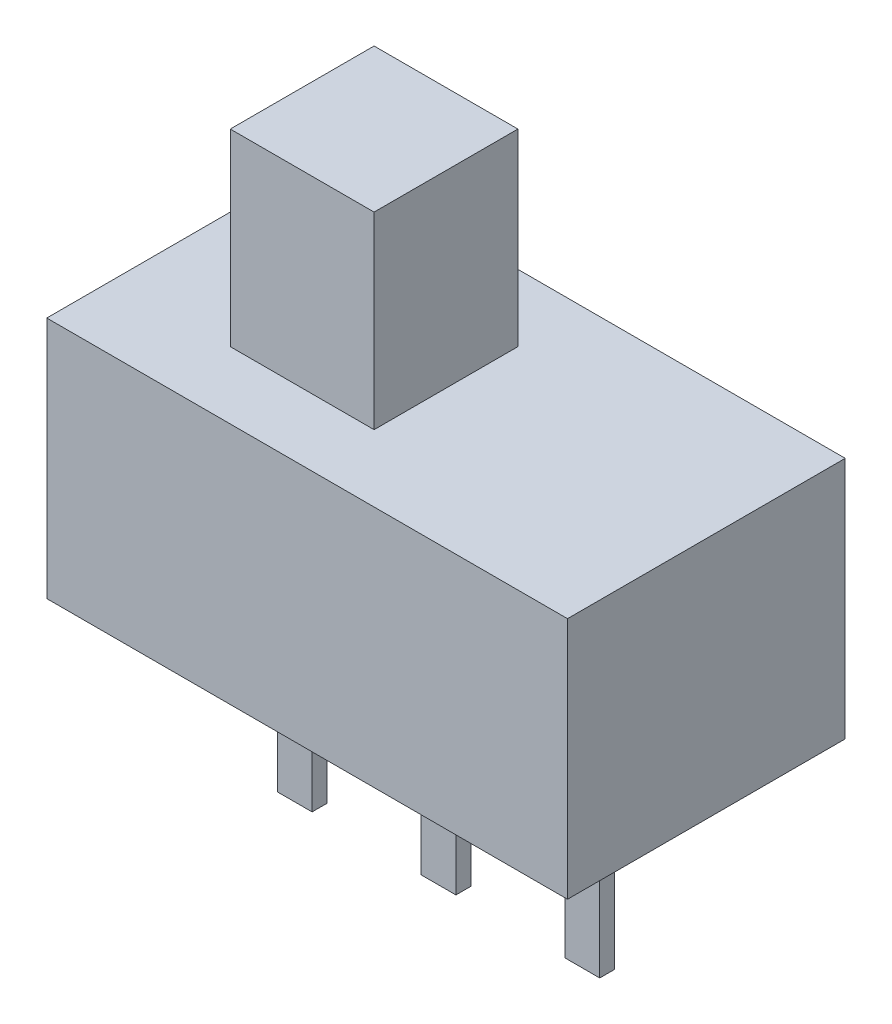
ISO-10303-21;
HEADER;
FILE_DESCRIPTION(('STEP AP214'),'2;1');
FILE_NAME('part.step','',(''),(''),'','','');
FILE_SCHEMA(('AUTOMOTIVE_DESIGN { 1 0 10303 214 1 1 1 1 }'));
ENDSEC;
DATA;
#1=APPLICATION_CONTEXT('core data for automotive mechanical design processes');
#2=APPLICATION_PROTOCOL_DEFINITION('international standard','automotive_design',2000,#1);
#3=PRODUCT_CONTEXT('',#1,'mechanical');
#4=PRODUCT('Part','Part','',(#3));
#5=PRODUCT_RELATED_PRODUCT_CATEGORY('part','',(#4));
#6=PRODUCT_DEFINITION_FORMATION('','',#4);
#7=PRODUCT_DEFINITION_CONTEXT('part definition',#1,'design');
#8=PRODUCT_DEFINITION('design','',#6,#7);
#9=PRODUCT_DEFINITION_SHAPE('','',#8);
#10=(LENGTH_UNIT() NAMED_UNIT(*) SI_UNIT(.MILLI.,.METRE.));
#11=(NAMED_UNIT(*) PLANE_ANGLE_UNIT() SI_UNIT($,.RADIAN.));
#12=(NAMED_UNIT(*) SI_UNIT($,.STERADIAN.) SOLID_ANGLE_UNIT());
#13=UNCERTAINTY_MEASURE_WITH_UNIT(LENGTH_MEASURE(1.E-05),#10,'distance_accuracy_value','');
#14=(GEOMETRIC_REPRESENTATION_CONTEXT(3) GLOBAL_UNCERTAINTY_ASSIGNED_CONTEXT((#13)) GLOBAL_UNIT_ASSIGNED_CONTEXT((#10,
#11,#12)) REPRESENTATION_CONTEXT('',''));
#15=CARTESIAN_POINT('',(0.,0.,0.));
#16=DIRECTION('',(0.,0.,1.));
#17=DIRECTION('',(1.,0.,0.));
#18=AXIS2_PLACEMENT_3D('',#15,#16,#17);
#19=CARTESIAN_POINT('',(0.,0.,0.));
#20=DIRECTION('',(0.,1.,0.));
#21=DIRECTION('',(0.,0.,1.));
#22=AXIS2_PLACEMENT_3D('',#19,#20,#21);
#23=PLANE('',#22);
#24=DIRECTION('',(0.,0.,1.));
#25=VECTOR('',#24,1.);
#26=CARTESIAN_POINT('',(3.25,0.,0.15));
#27=LINE('',#26,#25);
#28=CARTESIAN_POINT('',(3.25,0.,-0.15));
#29=VERTEX_POINT('',#28);
#30=CARTESIAN_POINT('',(3.25,0.,0.15));
#31=VERTEX_POINT('',#30);
#32=EDGE_CURVE('E192',#29,#31,#27,.T.);
#33=ORIENTED_EDGE('',*,*,#32,.F.);
#34=DIRECTION('',(1.,0.,0.));
#35=VECTOR('',#34,1.);
#36=CARTESIAN_POINT('',(2.55,0.,-0.15));
#37=LINE('',#36,#35);
#38=CARTESIAN_POINT('',(2.55,0.,-0.15));
#39=VERTEX_POINT('',#38);
#40=EDGE_CURVE('E205',#39,#29,#37,.T.);
#41=ORIENTED_EDGE('',*,*,#40,.F.);
#42=DIRECTION('',(0.,0.,-1.));
#43=VECTOR('',#42,1.);
#44=CARTESIAN_POINT('',(2.55,0.,0.15));
#45=LINE('',#44,#43);
#46=CARTESIAN_POINT('',(2.55,0.,0.15));
#47=VERTEX_POINT('',#46);
#48=EDGE_CURVE('E214',#47,#39,#45,.T.);
#49=ORIENTED_EDGE('',*,*,#48,.F.);
#50=DIRECTION('',(-1.,0.,0.));
#51=VECTOR('',#50,1.);
#52=CARTESIAN_POINT('',(2.55,0.,0.15));
#53=LINE('',#52,#51);
#54=EDGE_CURVE('E195',#31,#47,#53,.T.);
#55=ORIENTED_EDGE('',*,*,#54,.F.);
#56=EDGE_LOOP('',(#33,#41,#49,#55));
#57=FACE_BOUND('',#56,.T.);
#58=DIRECTION('',(0.,0.,-1.));
#59=VECTOR('',#58,1.);
#60=CARTESIAN_POINT('',(5.25,0.,-2.8));
#61=LINE('',#60,#59);
#62=CARTESIAN_POINT('',(5.25,0.,2.8));
#63=VERTEX_POINT('',#62);
#64=CARTESIAN_POINT('',(5.25,0.,-2.8));
#65=VERTEX_POINT('',#64);
#66=EDGE_CURVE('E292',#63,#65,#61,.T.);
#67=ORIENTED_EDGE('',*,*,#66,.F.);
#68=DIRECTION('',(1.,0.,0.));
#69=VECTOR('',#68,1.);
#70=CARTESIAN_POINT('',(-5.25,0.,2.8));
#71=LINE('',#70,#69);
#72=CARTESIAN_POINT('',(-5.25,0.,2.8));
#73=VERTEX_POINT('',#72);
#74=EDGE_CURVE('E297',#73,#63,#71,.T.);
#75=ORIENTED_EDGE('',*,*,#74,.F.);
#76=DIRECTION('',(0.,0.,1.));
#77=VECTOR('',#76,1.);
#78=CARTESIAN_POINT('',(-5.25,0.,-2.8));
#79=LINE('',#78,#77);
#80=CARTESIAN_POINT('',(-5.25,0.,-2.8));
#81=VERTEX_POINT('',#80);
#82=EDGE_CURVE('E308',#81,#73,#79,.T.);
#83=ORIENTED_EDGE('',*,*,#82,.F.);
#84=DIRECTION('',(-1.,0.,0.));
#85=VECTOR('',#84,1.);
#86=CARTESIAN_POINT('',(-5.25,0.,-2.8));
#87=LINE('',#86,#85);
#88=EDGE_CURVE('E306',#65,#81,#87,.T.);
#89=ORIENTED_EDGE('',*,*,#88,.F.);
#90=EDGE_LOOP('',(#67,#75,#83,#89));
#91=FACE_BOUND('',#90,.T.);
#92=DIRECTION('',(0.,0.,1.));
#93=VECTOR('',#92,1.);
#94=CARTESIAN_POINT('',(0.35,0.,0.15));
#95=LINE('',#94,#93);
#96=CARTESIAN_POINT('',(0.35,0.,-0.15));
#97=VERTEX_POINT('',#96);
#98=CARTESIAN_POINT('',(0.35,0.,0.15));
#99=VERTEX_POINT('',#98);
#100=EDGE_CURVE('E230',#97,#99,#95,.T.);
#101=ORIENTED_EDGE('',*,*,#100,.F.);
#102=DIRECTION('',(1.,0.,0.));
#103=VECTOR('',#102,1.);
#104=CARTESIAN_POINT('',(-0.35,0.,-0.15));
#105=LINE('',#104,#103);
#106=CARTESIAN_POINT('',(-0.35,0.,-0.15));
#107=VERTEX_POINT('',#106);
#108=EDGE_CURVE('E235',#107,#97,#105,.T.);
#109=ORIENTED_EDGE('',*,*,#108,.F.);
#110=DIRECTION('',(0.,0.,-1.));
#111=VECTOR('',#110,1.);
#112=CARTESIAN_POINT('',(-0.35,0.,0.15));
#113=LINE('',#112,#111);
#114=CARTESIAN_POINT('',(-0.35,0.,0.15));
#115=VERTEX_POINT('',#114);
#116=EDGE_CURVE('E247',#115,#107,#113,.T.);
#117=ORIENTED_EDGE('',*,*,#116,.F.);
#118=DIRECTION('',(-1.,0.,0.));
#119=VECTOR('',#118,1.);
#120=CARTESIAN_POINT('',(-0.35,0.,0.15));
#121=LINE('',#120,#119);
#122=EDGE_CURVE('E244',#99,#115,#121,.T.);
#123=ORIENTED_EDGE('',*,*,#122,.F.);
#124=EDGE_LOOP('',(#101,#109,#117,#123));
#125=FACE_BOUND('',#124,.T.);
#126=DIRECTION('',(0.,0.,1.));
#127=VECTOR('',#126,1.);
#128=CARTESIAN_POINT('',(-2.55,0.,0.15));
#129=LINE('',#128,#127);
#130=CARTESIAN_POINT('',(-2.55,0.,-0.15));
#131=VERTEX_POINT('',#130);
#132=CARTESIAN_POINT('',(-2.55,0.,0.15));
#133=VERTEX_POINT('',#132);
#134=EDGE_CURVE('E191',#131,#133,#129,.T.);
#135=ORIENTED_EDGE('',*,*,#134,.F.);
#136=DIRECTION('',(1.,0.,0.));
#137=VECTOR('',#136,1.);
#138=CARTESIAN_POINT('',(-3.25,0.,-0.15));
#139=LINE('',#138,#137);
#140=CARTESIAN_POINT('',(-3.25,0.,-0.15));
#141=VERTEX_POINT('',#140);
#142=EDGE_CURVE('E188',#141,#131,#139,.T.);
#143=ORIENTED_EDGE('',*,*,#142,.F.);
#144=DIRECTION('',(0.,0.,-1.));
#145=VECTOR('',#144,1.);
#146=CARTESIAN_POINT('',(-3.25,0.,0.15));
#147=LINE('',#146,#145);
#148=CARTESIAN_POINT('',(-3.25,0.,0.15));
#149=VERTEX_POINT('',#148);
#150=EDGE_CURVE('E54',#149,#141,#147,.T.);
#151=ORIENTED_EDGE('',*,*,#150,.F.);
#152=DIRECTION('',(-1.,0.,0.));
#153=VECTOR('',#152,1.);
#154=CARTESIAN_POINT('',(-3.25,0.,0.15));
#155=LINE('',#154,#153);
#156=EDGE_CURVE('E49',#133,#149,#155,.T.);
#157=ORIENTED_EDGE('',*,*,#156,.F.);
#158=EDGE_LOOP('',(#135,#143,#151,#157));
#159=FACE_BOUND('',#158,.T.);
#160=ADVANCED_FACE('F34',(#57,#91,#125,#159),#23,.F.);
#161=CARTESIAN_POINT('',(0.,4.9,0.));
#162=DIRECTION('',(0.,1.,0.));
#163=DIRECTION('',(0.,0.,1.));
#164=AXIS2_PLACEMENT_3D('',#161,#162,#163);
#165=PLANE('',#164);
#166=DIRECTION('',(0.,0.,-1.));
#167=VECTOR('',#166,1.);
#168=CARTESIAN_POINT('',(5.25,4.9,-2.8));
#169=LINE('',#168,#167);
#170=CARTESIAN_POINT('',(5.25,4.9,2.8));
#171=VERTEX_POINT('',#170);
#172=CARTESIAN_POINT('',(5.25,4.9,-2.8));
#173=VERTEX_POINT('',#172);
#174=EDGE_CURVE('E293',#171,#173,#169,.T.);
#175=ORIENTED_EDGE('',*,*,#174,.T.);
#176=DIRECTION('',(-1.,0.,0.));
#177=VECTOR('',#176,1.);
#178=CARTESIAN_POINT('',(-5.25,4.9,-2.8));
#179=LINE('',#178,#177);
#180=CARTESIAN_POINT('',(-5.25,4.9,-2.8));
#181=VERTEX_POINT('',#180);
#182=EDGE_CURVE('E296',#173,#181,#179,.T.);
#183=ORIENTED_EDGE('',*,*,#182,.T.);
#184=DIRECTION('',(0.,0.,1.));
#185=VECTOR('',#184,1.);
#186=CARTESIAN_POINT('',(-5.25,4.9,-2.8));
#187=LINE('',#186,#185);
#188=CARTESIAN_POINT('',(-5.25,4.9,2.8));
#189=VERTEX_POINT('',#188);
#190=EDGE_CURVE('E299',#181,#189,#187,.T.);
#191=ORIENTED_EDGE('',*,*,#190,.T.);
#192=DIRECTION('',(1.,0.,0.));
#193=VECTOR('',#192,1.);
#194=CARTESIAN_POINT('',(-5.25,4.9,2.8));
#195=LINE('',#194,#193);
#196=EDGE_CURVE('E301',#189,#171,#195,.T.);
#197=ORIENTED_EDGE('',*,*,#196,.T.);
#198=EDGE_LOOP('',(#175,#183,#191,#197));
#199=FACE_BOUND('',#198,.T.);
#200=DIRECTION('',(-1.,0.,0.));
#201=VECTOR('',#200,1.);
#202=CARTESIAN_POINT('',(-2.9,4.9,-1.45));
#203=LINE('',#202,#201);
#204=CARTESIAN_POINT('',(0.,4.9,-1.45));
#205=VERTEX_POINT('',#204);
#206=CARTESIAN_POINT('',(-2.9,4.9,-1.45));
#207=VERTEX_POINT('',#206);
#208=EDGE_CURVE('E277',#205,#207,#203,.T.);
#209=ORIENTED_EDGE('',*,*,#208,.F.);
#210=DIRECTION('',(0.,0.,-1.));
#211=VECTOR('',#210,1.);
#212=CARTESIAN_POINT('',(0.,4.9,-1.45));
#213=LINE('',#212,#211);
#214=CARTESIAN_POINT('',(0.,4.9,1.45));
#215=VERTEX_POINT('',#214);
#216=EDGE_CURVE('E263',#215,#205,#213,.T.);
#217=ORIENTED_EDGE('',*,*,#216,.F.);
#218=DIRECTION('',(1.,0.,0.));
#219=VECTOR('',#218,1.);
#220=CARTESIAN_POINT('',(-2.9,4.9,1.45));
#221=LINE('',#220,#219);
#222=CARTESIAN_POINT('',(-2.9,4.9,1.45));
#223=VERTEX_POINT('',#222);
#224=EDGE_CURVE('E268',#223,#215,#221,.T.);
#225=ORIENTED_EDGE('',*,*,#224,.F.);
#226=DIRECTION('',(0.,0.,1.));
#227=VECTOR('',#226,1.);
#228=CARTESIAN_POINT('',(-2.9,4.9,-1.45));
#229=LINE('',#228,#227);
#230=EDGE_CURVE('E279',#207,#223,#229,.T.);
#231=ORIENTED_EDGE('',*,*,#230,.F.);
#232=EDGE_LOOP('',(#209,#217,#225,#231));
#233=FACE_BOUND('',#232,.T.);
#234=ADVANCED_FACE('F335',(#199,#233),#165,.T.);
#235=CARTESIAN_POINT('',(5.25,4.9,-2.8));
#236=DIRECTION('',(-1.,0.,0.));
#237=DIRECTION('',(0.,0.,1.));
#238=AXIS2_PLACEMENT_3D('',#235,#236,#237);
#239=PLANE('',#238);
#240=ORIENTED_EDGE('',*,*,#66,.T.);
#241=DIRECTION('',(0.,-1.,0.));
#242=VECTOR('',#241,1.);
#243=CARTESIAN_POINT('',(5.25,4.9,-2.8));
#244=LINE('',#243,#242);
#245=EDGE_CURVE('E11',#173,#65,#244,.T.);
#246=ORIENTED_EDGE('',*,*,#245,.F.);
#247=ORIENTED_EDGE('',*,*,#174,.F.);
#248=DIRECTION('',(0.,-1.,0.));
#249=VECTOR('',#248,1.);
#250=CARTESIAN_POINT('',(5.25,4.9,2.8));
#251=LINE('',#250,#249);
#252=EDGE_CURVE('E303',#171,#63,#251,.T.);
#253=ORIENTED_EDGE('',*,*,#252,.T.);
#254=EDGE_LOOP('',(#240,#246,#247,#253));
#255=FACE_BOUND('',#254,.T.);
#256=ADVANCED_FACE('F36',(#255),#239,.F.);
#257=CARTESIAN_POINT('',(-5.25,4.9,-2.8));
#258=DIRECTION('',(0.,0.,1.));
#259=DIRECTION('',(1.,0.,0.));
#260=AXIS2_PLACEMENT_3D('',#257,#258,#259);
#261=PLANE('',#260);
#262=ORIENTED_EDGE('',*,*,#88,.T.);
#263=DIRECTION('',(0.,-1.,0.));
#264=VECTOR('',#263,1.);
#265=CARTESIAN_POINT('',(-5.25,4.9,-2.8));
#266=LINE('',#265,#264);
#267=EDGE_CURVE('E42',#181,#81,#266,.T.);
#268=ORIENTED_EDGE('',*,*,#267,.F.);
#269=ORIENTED_EDGE('',*,*,#182,.F.);
#270=ORIENTED_EDGE('',*,*,#245,.T.);
#271=EDGE_LOOP('',(#262,#268,#269,#270));
#272=FACE_BOUND('',#271,.T.);
#273=ADVANCED_FACE('F337',(#272),#261,.F.);
#274=CARTESIAN_POINT('',(-5.25,4.9,-2.8));
#275=DIRECTION('',(1.,0.,0.));
#276=DIRECTION('',(0.,0.,-1.));
#277=AXIS2_PLACEMENT_3D('',#274,#275,#276);
#278=PLANE('',#277);
#279=ORIENTED_EDGE('',*,*,#82,.T.);
#280=DIRECTION('',(0.,-1.,0.));
#281=VECTOR('',#280,1.);
#282=CARTESIAN_POINT('',(-5.25,4.9,2.8));
#283=LINE('',#282,#281);
#284=EDGE_CURVE('E313',#189,#73,#283,.T.);
#285=ORIENTED_EDGE('',*,*,#284,.F.);
#286=ORIENTED_EDGE('',*,*,#190,.F.);
#287=ORIENTED_EDGE('',*,*,#267,.T.);
#288=EDGE_LOOP('',(#279,#285,#286,#287));
#289=FACE_BOUND('',#288,.T.);
#290=ADVANCED_FACE('F320',(#289),#278,.F.);
#291=CARTESIAN_POINT('',(-5.25,4.9,2.8));
#292=DIRECTION('',(0.,0.,-1.));
#293=DIRECTION('',(-1.,0.,0.));
#294=AXIS2_PLACEMENT_3D('',#291,#292,#293);
#295=PLANE('',#294);
#296=ORIENTED_EDGE('',*,*,#74,.T.);
#297=ORIENTED_EDGE('',*,*,#252,.F.);
#298=ORIENTED_EDGE('',*,*,#196,.F.);
#299=ORIENTED_EDGE('',*,*,#284,.T.);
#300=EDGE_LOOP('',(#296,#297,#298,#299));
#301=FACE_BOUND('',#300,.T.);
#302=ADVANCED_FACE('F329',(#301),#295,.F.);
#303=CARTESIAN_POINT('',(0.,8.7,-1.45));
#304=DIRECTION('',(-1.,0.,0.));
#305=DIRECTION('',(0.,0.,1.));
#306=AXIS2_PLACEMENT_3D('',#303,#304,#305);
#307=PLANE('',#306);
#308=ORIENTED_EDGE('',*,*,#216,.T.);
#309=DIRECTION('',(0.,-1.,0.));
#310=VECTOR('',#309,1.);
#311=CARTESIAN_POINT('',(0.,8.7,-1.45));
#312=LINE('',#311,#310);
#313=CARTESIAN_POINT('',(0.,8.7,-1.45));
#314=VERTEX_POINT('',#313);
#315=EDGE_CURVE('E290',#314,#205,#312,.T.);
#316=ORIENTED_EDGE('',*,*,#315,.F.);
#317=DIRECTION('',(0.,0.,-1.));
#318=VECTOR('',#317,1.);
#319=CARTESIAN_POINT('',(0.,8.7,-1.45));
#320=LINE('',#319,#318);
#321=CARTESIAN_POINT('',(0.,8.7,1.45));
#322=VERTEX_POINT('',#321);
#323=EDGE_CURVE('E264',#322,#314,#320,.T.);
#324=ORIENTED_EDGE('',*,*,#323,.F.);
#325=DIRECTION('',(0.,-1.,0.));
#326=VECTOR('',#325,1.);
#327=CARTESIAN_POINT('',(0.,8.7,1.45));
#328=LINE('',#327,#326);
#329=EDGE_CURVE('E274',#322,#215,#328,.T.);
#330=ORIENTED_EDGE('',*,*,#329,.T.);
#331=EDGE_LOOP('',(#308,#316,#324,#330));
#332=FACE_BOUND('',#331,.T.);
#333=ADVANCED_FACE('F354',(#332),#307,.F.);
#334=CARTESIAN_POINT('',(-2.9,8.7,-1.45));
#335=DIRECTION('',(0.,0.,1.));
#336=DIRECTION('',(1.,0.,0.));
#337=AXIS2_PLACEMENT_3D('',#334,#335,#336);
#338=PLANE('',#337);
#339=ORIENTED_EDGE('',*,*,#208,.T.);
#340=DIRECTION('',(0.,-1.,0.));
#341=VECTOR('',#340,1.);
#342=CARTESIAN_POINT('',(-2.9,8.7,-1.45));
#343=LINE('',#342,#341);
#344=CARTESIAN_POINT('',(-2.9,8.7,-1.45));
#345=VERTEX_POINT('',#344);
#346=EDGE_CURVE('E287',#345,#207,#343,.T.);
#347=ORIENTED_EDGE('',*,*,#346,.F.);
#348=DIRECTION('',(-1.,0.,0.));
#349=VECTOR('',#348,1.);
#350=CARTESIAN_POINT('',(-2.9,8.7,-1.45));
#351=LINE('',#350,#349);
#352=EDGE_CURVE('E267',#314,#345,#351,.T.);
#353=ORIENTED_EDGE('',*,*,#352,.F.);
#354=ORIENTED_EDGE('',*,*,#315,.T.);
#355=EDGE_LOOP('',(#339,#347,#353,#354));
#356=FACE_BOUND('',#355,.T.);
#357=ADVANCED_FACE('F358',(#356),#338,.F.);
#358=CARTESIAN_POINT('',(-2.9,8.7,-1.45));
#359=DIRECTION('',(1.,0.,0.));
#360=DIRECTION('',(0.,0.,-1.));
#361=AXIS2_PLACEMENT_3D('',#358,#359,#360);
#362=PLANE('',#361);
#363=ORIENTED_EDGE('',*,*,#230,.T.);
#364=DIRECTION('',(0.,-1.,0.));
#365=VECTOR('',#364,1.);
#366=CARTESIAN_POINT('',(-2.9,8.7,1.45));
#367=LINE('',#366,#365);
#368=CARTESIAN_POINT('',(-2.9,8.7,1.45));
#369=VERTEX_POINT('',#368);
#370=EDGE_CURVE('E285',#369,#223,#367,.T.);
#371=ORIENTED_EDGE('',*,*,#370,.F.);
#372=DIRECTION('',(0.,0.,1.));
#373=VECTOR('',#372,1.);
#374=CARTESIAN_POINT('',(-2.9,8.7,-1.45));
#375=LINE('',#374,#373);
#376=EDGE_CURVE('E270',#345,#369,#375,.T.);
#377=ORIENTED_EDGE('',*,*,#376,.F.);
#378=ORIENTED_EDGE('',*,*,#346,.T.);
#379=EDGE_LOOP('',(#363,#371,#377,#378));
#380=FACE_BOUND('',#379,.T.);
#381=ADVANCED_FACE('F363',(#380),#362,.F.);
#382=CARTESIAN_POINT('',(-2.9,8.7,1.45));
#383=DIRECTION('',(0.,0.,-1.));
#384=DIRECTION('',(-1.,0.,0.));
#385=AXIS2_PLACEMENT_3D('',#382,#383,#384);
#386=PLANE('',#385);
#387=ORIENTED_EDGE('',*,*,#224,.T.);
#388=ORIENTED_EDGE('',*,*,#329,.F.);
#389=DIRECTION('',(1.,0.,0.));
#390=VECTOR('',#389,1.);
#391=CARTESIAN_POINT('',(-2.9,8.7,1.45));
#392=LINE('',#391,#390);
#393=EDGE_CURVE('E272',#369,#322,#392,.T.);
#394=ORIENTED_EDGE('',*,*,#393,.F.);
#395=ORIENTED_EDGE('',*,*,#370,.T.);
#396=EDGE_LOOP('',(#387,#388,#394,#395));
#397=FACE_BOUND('',#396,.T.);
#398=ADVANCED_FACE('F369',(#397),#386,.F.);
#399=CARTESIAN_POINT('',(0.,8.7,0.));
#400=DIRECTION('',(0.,1.,0.));
#401=DIRECTION('',(0.,0.,1.));
#402=AXIS2_PLACEMENT_3D('',#399,#400,#401);
#403=PLANE('',#402);
#404=ORIENTED_EDGE('',*,*,#323,.T.);
#405=ORIENTED_EDGE('',*,*,#352,.T.);
#406=ORIENTED_EDGE('',*,*,#376,.T.);
#407=ORIENTED_EDGE('',*,*,#393,.T.);
#408=EDGE_LOOP('',(#404,#405,#406,#407));
#409=FACE_BOUND('',#408,.T.);
#410=ADVANCED_FACE('F373',(#409),#403,.T.);
#411=CARTESIAN_POINT('',(0.35,-3.7,0.15));
#412=DIRECTION('',(-1.,0.,0.));
#413=DIRECTION('',(0.,0.,1.));
#414=AXIS2_PLACEMENT_3D('',#411,#412,#413);
#415=PLANE('',#414);
#416=ORIENTED_EDGE('',*,*,#100,.T.);
#417=DIRECTION('',(0.,1.,0.));
#418=VECTOR('',#417,1.);
#419=CARTESIAN_POINT('',(0.35,-3.7,0.15));
#420=LINE('',#419,#418);
#421=CARTESIAN_POINT('',(0.35,-3.7,0.15));
#422=VERTEX_POINT('',#421);
#423=EDGE_CURVE('E260',#422,#99,#420,.T.);
#424=ORIENTED_EDGE('',*,*,#423,.F.);
#425=DIRECTION('',(0.,0.,1.));
#426=VECTOR('',#425,1.);
#427=CARTESIAN_POINT('',(0.35,-3.7,0.15));
#428=LINE('',#427,#426);
#429=CARTESIAN_POINT('',(0.35,-3.7,-0.15));
#430=VERTEX_POINT('',#429);
#431=EDGE_CURVE('E231',#430,#422,#428,.T.);
#432=ORIENTED_EDGE('',*,*,#431,.F.);
#433=DIRECTION('',(0.,1.,0.));
#434=VECTOR('',#433,1.);
#435=CARTESIAN_POINT('',(0.35,-3.7,-0.15));
#436=LINE('',#435,#434);
#437=EDGE_CURVE('E241',#430,#97,#436,.T.);
#438=ORIENTED_EDGE('',*,*,#437,.T.);
#439=EDGE_LOOP('',(#416,#424,#432,#438));
#440=FACE_BOUND('',#439,.T.);
#441=ADVANCED_FACE('F377',(#440),#415,.F.);
#442=CARTESIAN_POINT('',(-0.35,-3.7,0.15));
#443=DIRECTION('',(0.,0.,-1.));
#444=DIRECTION('',(-1.,0.,0.));
#445=AXIS2_PLACEMENT_3D('',#442,#443,#444);
#446=PLANE('',#445);
#447=ORIENTED_EDGE('',*,*,#122,.T.);
#448=DIRECTION('',(0.,1.,0.));
#449=VECTOR('',#448,1.);
#450=CARTESIAN_POINT('',(-0.35,-3.7,0.15));
#451=LINE('',#450,#449);
#452=CARTESIAN_POINT('',(-0.35,-3.7,0.15));
#453=VERTEX_POINT('',#452);
#454=EDGE_CURVE('E257',#453,#115,#451,.T.);
#455=ORIENTED_EDGE('',*,*,#454,.F.);
#456=DIRECTION('',(-1.,0.,0.));
#457=VECTOR('',#456,1.);
#458=CARTESIAN_POINT('',(-0.35,-3.7,0.15));
#459=LINE('',#458,#457);
#460=EDGE_CURVE('E234',#422,#453,#459,.T.);
#461=ORIENTED_EDGE('',*,*,#460,.F.);
#462=ORIENTED_EDGE('',*,*,#423,.T.);
#463=EDGE_LOOP('',(#447,#455,#461,#462));
#464=FACE_BOUND('',#463,.T.);
#465=ADVANCED_FACE('F381',(#464),#446,.F.);
#466=CARTESIAN_POINT('',(-0.35,-3.7,0.15));
#467=DIRECTION('',(1.,0.,0.));
#468=DIRECTION('',(0.,0.,-1.));
#469=AXIS2_PLACEMENT_3D('',#466,#467,#468);
#470=PLANE('',#469);
#471=ORIENTED_EDGE('',*,*,#116,.T.);
#472=DIRECTION('',(0.,1.,0.));
#473=VECTOR('',#472,1.);
#474=CARTESIAN_POINT('',(-0.35,-3.7,-0.15));
#475=LINE('',#474,#473);
#476=CARTESIAN_POINT('',(-0.35,-3.7,-0.15));
#477=VERTEX_POINT('',#476);
#478=EDGE_CURVE('E254',#477,#107,#475,.T.);
#479=ORIENTED_EDGE('',*,*,#478,.F.);
#480=DIRECTION('',(0.,0.,-1.));
#481=VECTOR('',#480,1.);
#482=CARTESIAN_POINT('',(-0.35,-3.7,0.15));
#483=LINE('',#482,#481);
#484=EDGE_CURVE('E237',#453,#477,#483,.T.);
#485=ORIENTED_EDGE('',*,*,#484,.F.);
#486=ORIENTED_EDGE('',*,*,#454,.T.);
#487=EDGE_LOOP('',(#471,#479,#485,#486));
#488=FACE_BOUND('',#487,.T.);
#489=ADVANCED_FACE('F385',(#488),#470,.F.);
#490=CARTESIAN_POINT('',(-0.35,-3.7,-0.15));
#491=DIRECTION('',(0.,0.,1.));
#492=DIRECTION('',(1.,0.,0.));
#493=AXIS2_PLACEMENT_3D('',#490,#491,#492);
#494=PLANE('',#493);
#495=ORIENTED_EDGE('',*,*,#108,.T.);
#496=ORIENTED_EDGE('',*,*,#437,.F.);
#497=DIRECTION('',(1.,0.,0.));
#498=VECTOR('',#497,1.);
#499=CARTESIAN_POINT('',(-0.35,-3.7,-0.15));
#500=LINE('',#499,#498);
#501=EDGE_CURVE('E239',#477,#430,#500,.T.);
#502=ORIENTED_EDGE('',*,*,#501,.F.);
#503=ORIENTED_EDGE('',*,*,#478,.T.);
#504=EDGE_LOOP('',(#495,#496,#502,#503));
#505=FACE_BOUND('',#504,.T.);
#506=ADVANCED_FACE('F389',(#505),#494,.F.);
#507=CARTESIAN_POINT('',(0.,-3.7,0.));
#508=DIRECTION('',(0.,-1.,0.));
#509=DIRECTION('',(0.,0.,-1.));
#510=AXIS2_PLACEMENT_3D('',#507,#508,#509);
#511=PLANE('',#510);
#512=ORIENTED_EDGE('',*,*,#431,.T.);
#513=ORIENTED_EDGE('',*,*,#460,.T.);
#514=ORIENTED_EDGE('',*,*,#484,.T.);
#515=ORIENTED_EDGE('',*,*,#501,.T.);
#516=EDGE_LOOP('',(#512,#513,#514,#515));
#517=FACE_BOUND('',#516,.T.);
#518=ADVANCED_FACE('F393',(#517),#511,.T.);
#519=CARTESIAN_POINT('',(3.25,-3.7,0.15));
#520=DIRECTION('',(-1.,0.,0.));
#521=DIRECTION('',(0.,0.,1.));
#522=AXIS2_PLACEMENT_3D('',#519,#520,#521);
#523=PLANE('',#522);
#524=ORIENTED_EDGE('',*,*,#32,.T.);
#525=DIRECTION('',(0.,1.,0.));
#526=VECTOR('',#525,1.);
#527=CARTESIAN_POINT('',(3.25,-3.7,0.15));
#528=LINE('',#527,#526);
#529=CARTESIAN_POINT('',(3.25,-3.7,0.15));
#530=VERTEX_POINT('',#529);
#531=EDGE_CURVE('E227',#530,#31,#528,.T.);
#532=ORIENTED_EDGE('',*,*,#531,.F.);
#533=DIRECTION('',(0.,0.,1.));
#534=VECTOR('',#533,1.);
#535=CARTESIAN_POINT('',(3.25,-3.7,0.15));
#536=LINE('',#535,#534);
#537=CARTESIAN_POINT('',(3.25,-3.7,-0.15));
#538=VERTEX_POINT('',#537);
#539=EDGE_CURVE('E201',#538,#530,#536,.T.);
#540=ORIENTED_EDGE('',*,*,#539,.F.);
#541=DIRECTION('',(0.,1.,0.));
#542=VECTOR('',#541,1.);
#543=CARTESIAN_POINT('',(3.25,-3.7,-0.15));
#544=LINE('',#543,#542);
#545=EDGE_CURVE('E210',#538,#29,#544,.T.);
#546=ORIENTED_EDGE('',*,*,#545,.T.);
#547=EDGE_LOOP('',(#524,#532,#540,#546));
#548=FACE_BOUND('',#547,.T.);
#549=ADVANCED_FACE('F397',(#548),#523,.F.);
#550=CARTESIAN_POINT('',(2.55,-3.7,0.15));
#551=DIRECTION('',(0.,0.,-1.));
#552=DIRECTION('',(-1.,0.,0.));
#553=AXIS2_PLACEMENT_3D('',#550,#551,#552);
#554=PLANE('',#553);
#555=ORIENTED_EDGE('',*,*,#54,.T.);
#556=DIRECTION('',(0.,1.,0.));
#557=VECTOR('',#556,1.);
#558=CARTESIAN_POINT('',(2.55,-3.7,0.15));
#559=LINE('',#558,#557);
#560=CARTESIAN_POINT('',(2.55,-3.7,0.15));
#561=VERTEX_POINT('',#560);
#562=EDGE_CURVE('E224',#561,#47,#559,.T.);
#563=ORIENTED_EDGE('',*,*,#562,.F.);
#564=DIRECTION('',(-1.,0.,0.));
#565=VECTOR('',#564,1.);
#566=CARTESIAN_POINT('',(2.55,-3.7,0.15));
#567=LINE('',#566,#565);
#568=EDGE_CURVE('E204',#530,#561,#567,.T.);
#569=ORIENTED_EDGE('',*,*,#568,.F.);
#570=ORIENTED_EDGE('',*,*,#531,.T.);
#571=EDGE_LOOP('',(#555,#563,#569,#570));
#572=FACE_BOUND('',#571,.T.);
#573=ADVANCED_FACE('F401',(#572),#554,.F.);
#574=CARTESIAN_POINT('',(2.55,-3.7,0.15));
#575=DIRECTION('',(1.,0.,0.));
#576=DIRECTION('',(0.,0.,-1.));
#577=AXIS2_PLACEMENT_3D('',#574,#575,#576);
#578=PLANE('',#577);
#579=ORIENTED_EDGE('',*,*,#48,.T.);
#580=DIRECTION('',(0.,1.,0.));
#581=VECTOR('',#580,1.);
#582=CARTESIAN_POINT('',(2.55,-3.7,-0.15));
#583=LINE('',#582,#581);
#584=CARTESIAN_POINT('',(2.55,-3.7,-0.15));
#585=VERTEX_POINT('',#584);
#586=EDGE_CURVE('E221',#585,#39,#583,.T.);
#587=ORIENTED_EDGE('',*,*,#586,.F.);
#588=DIRECTION('',(0.,0.,-1.));
#589=VECTOR('',#588,1.);
#590=CARTESIAN_POINT('',(2.55,-3.7,0.15));
#591=LINE('',#590,#589);
#592=EDGE_CURVE('E207',#561,#585,#591,.T.);
#593=ORIENTED_EDGE('',*,*,#592,.F.);
#594=ORIENTED_EDGE('',*,*,#562,.T.);
#595=EDGE_LOOP('',(#579,#587,#593,#594));
#596=FACE_BOUND('',#595,.T.);
#597=ADVANCED_FACE('F405',(#596),#578,.F.);
#598=CARTESIAN_POINT('',(2.55,-3.7,-0.15));
#599=DIRECTION('',(0.,0.,1.));
#600=DIRECTION('',(1.,0.,0.));
#601=AXIS2_PLACEMENT_3D('',#598,#599,#600);
#602=PLANE('',#601);
#603=ORIENTED_EDGE('',*,*,#40,.T.);
#604=ORIENTED_EDGE('',*,*,#545,.F.);
#605=DIRECTION('',(1.,0.,0.));
#606=VECTOR('',#605,1.);
#607=CARTESIAN_POINT('',(2.55,-3.7,-0.15));
#608=LINE('',#607,#606);
#609=EDGE_CURVE('E209',#585,#538,#608,.T.);
#610=ORIENTED_EDGE('',*,*,#609,.F.);
#611=ORIENTED_EDGE('',*,*,#586,.T.);
#612=EDGE_LOOP('',(#603,#604,#610,#611));
#613=FACE_BOUND('',#612,.T.);
#614=ADVANCED_FACE('F409',(#613),#602,.F.);
#615=CARTESIAN_POINT('',(0.,-3.7,0.));
#616=DIRECTION('',(0.,-1.,0.));
#617=DIRECTION('',(0.,0.,-1.));
#618=AXIS2_PLACEMENT_3D('',#615,#616,#617);
#619=PLANE('',#618);
#620=ORIENTED_EDGE('',*,*,#539,.T.);
#621=ORIENTED_EDGE('',*,*,#568,.T.);
#622=ORIENTED_EDGE('',*,*,#592,.T.);
#623=ORIENTED_EDGE('',*,*,#609,.T.);
#624=EDGE_LOOP('',(#620,#621,#622,#623));
#625=FACE_BOUND('',#624,.T.);
#626=ADVANCED_FACE('F413',(#625),#619,.T.);
#627=CARTESIAN_POINT('',(-2.55,-3.7,0.15));
#628=DIRECTION('',(-1.,0.,0.));
#629=DIRECTION('',(0.,0.,1.));
#630=AXIS2_PLACEMENT_3D('',#627,#628,#629);
#631=PLANE('',#630);
#632=ORIENTED_EDGE('',*,*,#134,.T.);
#633=DIRECTION('',(0.,1.,0.));
#634=VECTOR('',#633,1.);
#635=CARTESIAN_POINT('',(-2.55,-3.7,0.15));
#636=LINE('',#635,#634);
#637=CARTESIAN_POINT('',(-2.55,-3.7,0.15));
#638=VERTEX_POINT('',#637);
#639=EDGE_CURVE('E172',#638,#133,#636,.T.);
#640=ORIENTED_EDGE('',*,*,#639,.F.);
#641=DIRECTION('',(0.,0.,1.));
#642=VECTOR('',#641,1.);
#643=CARTESIAN_POINT('',(-2.55,-3.7,0.15));
#644=LINE('',#643,#642);
#645=CARTESIAN_POINT('',(-2.55,-3.7,-0.15));
#646=VERTEX_POINT('',#645);
#647=EDGE_CURVE('E179',#646,#638,#644,.T.);
#648=ORIENTED_EDGE('',*,*,#647,.F.);
#649=DIRECTION('',(0.,1.,0.));
#650=VECTOR('',#649,1.);
#651=CARTESIAN_POINT('',(-2.55,-3.7,-0.15));
#652=LINE('',#651,#650);
#653=EDGE_CURVE('E603',#646,#131,#652,.T.);
#654=ORIENTED_EDGE('',*,*,#653,.T.);
#655=EDGE_LOOP('',(#632,#640,#648,#654));
#656=FACE_BOUND('',#655,.T.);
#657=ADVANCED_FACE('F190',(#656),#631,.F.);
#658=CARTESIAN_POINT('',(-3.25,-3.7,0.15));
#659=DIRECTION('',(0.,0.,-1.));
#660=DIRECTION('',(-1.,0.,0.));
#661=AXIS2_PLACEMENT_3D('',#658,#659,#660);
#662=PLANE('',#661);
#663=ORIENTED_EDGE('',*,*,#156,.T.);
#664=DIRECTION('',(0.,1.,0.));
#665=VECTOR('',#664,1.);
#666=CARTESIAN_POINT('',(-3.25,-3.7,0.15));
#667=LINE('',#666,#665);
#668=CARTESIAN_POINT('',(-3.25,-3.7,0.15));
#669=VERTEX_POINT('',#668);
#670=EDGE_CURVE('E175',#669,#149,#667,.T.);
#671=ORIENTED_EDGE('',*,*,#670,.F.);
#672=DIRECTION('',(-1.,0.,0.));
#673=VECTOR('',#672,1.);
#674=CARTESIAN_POINT('',(-3.25,-3.7,0.15));
#675=LINE('',#674,#673);
#676=EDGE_CURVE('E168',#638,#669,#675,.T.);
#677=ORIENTED_EDGE('',*,*,#676,.F.);
#678=ORIENTED_EDGE('',*,*,#639,.T.);
#679=EDGE_LOOP('',(#663,#671,#677,#678));
#680=FACE_BOUND('',#679,.T.);
#681=ADVANCED_FACE('F170',(#680),#662,.F.);
#682=CARTESIAN_POINT('',(-3.25,-3.7,0.15));
#683=DIRECTION('',(1.,0.,0.));
#684=DIRECTION('',(0.,0.,-1.));
#685=AXIS2_PLACEMENT_3D('',#682,#683,#684);
#686=PLANE('',#685);
#687=ORIENTED_EDGE('',*,*,#150,.T.);
#688=DIRECTION('',(0.,1.,0.));
#689=VECTOR('',#688,1.);
#690=CARTESIAN_POINT('',(-3.25,-3.7,-0.15));
#691=LINE('',#690,#689);
#692=CARTESIAN_POINT('',(-3.25,-3.7,-0.15));
#693=VERTEX_POINT('',#692);
#694=EDGE_CURVE('E197',#693,#141,#691,.T.);
#695=ORIENTED_EDGE('',*,*,#694,.F.);
#696=DIRECTION('',(0.,0.,-1.));
#697=VECTOR('',#696,1.);
#698=CARTESIAN_POINT('',(-3.25,-3.7,0.15));
#699=LINE('',#698,#697);
#700=EDGE_CURVE('E178',#669,#693,#699,.T.);
#701=ORIENTED_EDGE('',*,*,#700,.F.);
#702=ORIENTED_EDGE('',*,*,#670,.T.);
#703=EDGE_LOOP('',(#687,#695,#701,#702));
#704=FACE_BOUND('',#703,.T.);
#705=ADVANCED_FACE('F422',(#704),#686,.F.);
#706=CARTESIAN_POINT('',(-3.25,-3.7,-0.15));
#707=DIRECTION('',(0.,0.,1.));
#708=DIRECTION('',(1.,0.,0.));
#709=AXIS2_PLACEMENT_3D('',#706,#707,#708);
#710=PLANE('',#709);
#711=ORIENTED_EDGE('',*,*,#142,.T.);
#712=ORIENTED_EDGE('',*,*,#653,.F.);
#713=DIRECTION('',(1.,0.,0.));
#714=VECTOR('',#713,1.);
#715=CARTESIAN_POINT('',(-3.25,-3.7,-0.15));
#716=LINE('',#715,#714);
#717=EDGE_CURVE('E184',#693,#646,#716,.T.);
#718=ORIENTED_EDGE('',*,*,#717,.F.);
#719=ORIENTED_EDGE('',*,*,#694,.T.);
#720=EDGE_LOOP('',(#711,#712,#718,#719));
#721=FACE_BOUND('',#720,.T.);
#722=ADVANCED_FACE('F425',(#721),#710,.F.);
#723=CARTESIAN_POINT('',(0.,-3.7,0.));
#724=DIRECTION('',(0.,-1.,0.));
#725=DIRECTION('',(0.,0.,-1.));
#726=AXIS2_PLACEMENT_3D('',#723,#724,#725);
#727=PLANE('',#726);
#728=ORIENTED_EDGE('',*,*,#647,.T.);
#729=ORIENTED_EDGE('',*,*,#676,.T.);
#730=ORIENTED_EDGE('',*,*,#700,.T.);
#731=ORIENTED_EDGE('',*,*,#717,.T.);
#732=EDGE_LOOP('',(#728,#729,#730,#731));
#733=FACE_BOUND('',#732,.T.);
#734=ADVANCED_FACE('F182',(#733),#727,.T.);
#735=CLOSED_SHELL('',(#160,#234,#256,#273,#290,#302,#333,#357,#381,#398,#410,#441,#465,#489,
#506,#518,#549,#573,#597,#614,#626,#657,#681,#705,#722,#734));
#736=MANIFOLD_SOLID_BREP('B2',#735);
#737=ADVANCED_BREP_SHAPE_REPRESENTATION('',(#18,#736),#14);
#738=SHAPE_DEFINITION_REPRESENTATION(#9,#737);
ENDSEC;
END-ISO-10303-21;
